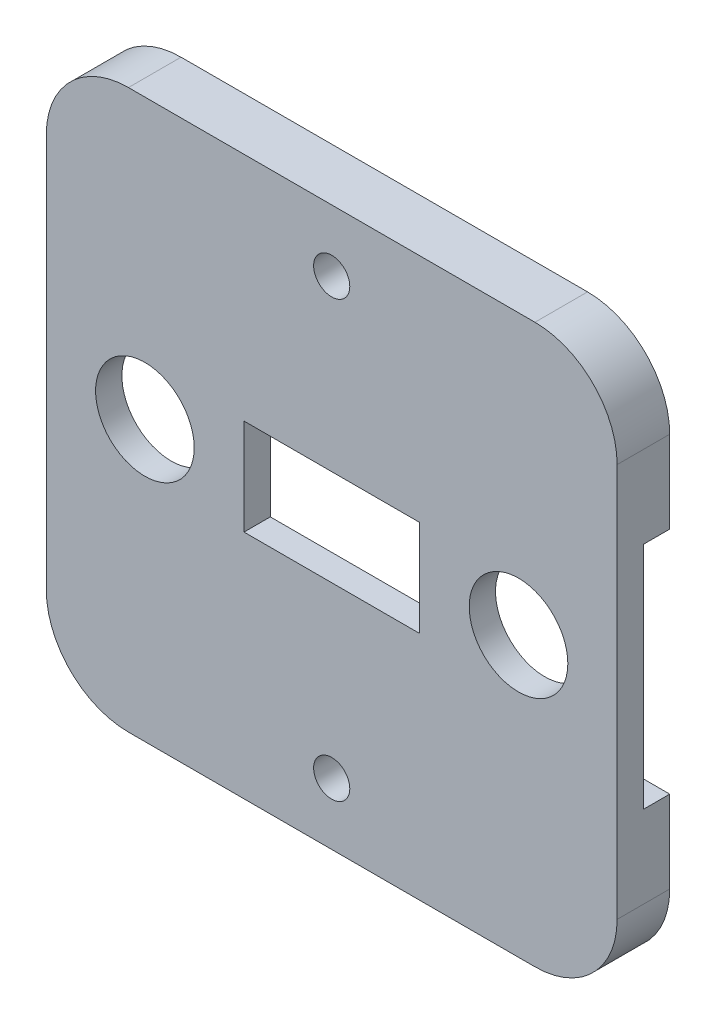
ISO-10303-21;
HEADER;
FILE_DESCRIPTION(('STEP AP214'),'2;1');
FILE_NAME('part.step','',(''),(''),'','','');
FILE_SCHEMA(('AUTOMOTIVE_DESIGN { 1 0 10303 214 1 1 1 1 }'));
ENDSEC;
DATA;
#1=APPLICATION_CONTEXT('core data for automotive mechanical design processes');
#2=APPLICATION_PROTOCOL_DEFINITION('international standard','automotive_design',2000,#1);
#3=PRODUCT_CONTEXT('',#1,'mechanical');
#4=PRODUCT('Part','Part','',(#3));
#5=PRODUCT_RELATED_PRODUCT_CATEGORY('part','',(#4));
#6=PRODUCT_DEFINITION_FORMATION('','',#4);
#7=PRODUCT_DEFINITION_CONTEXT('part definition',#1,'design');
#8=PRODUCT_DEFINITION('design','',#6,#7);
#9=PRODUCT_DEFINITION_SHAPE('','',#8);
#10=(LENGTH_UNIT() NAMED_UNIT(*) SI_UNIT(.MILLI.,.METRE.));
#11=(NAMED_UNIT(*) PLANE_ANGLE_UNIT() SI_UNIT($,.RADIAN.));
#12=(NAMED_UNIT(*) SI_UNIT($,.STERADIAN.) SOLID_ANGLE_UNIT());
#13=UNCERTAINTY_MEASURE_WITH_UNIT(LENGTH_MEASURE(1.E-05),#10,'distance_accuracy_value','');
#14=(GEOMETRIC_REPRESENTATION_CONTEXT(3) GLOBAL_UNCERTAINTY_ASSIGNED_CONTEXT((#13)) GLOBAL_UNIT_ASSIGNED_CONTEXT((#10,
#11,#12)) REPRESENTATION_CONTEXT('',''));
#15=CARTESIAN_POINT('',(0.,0.,0.));
#16=DIRECTION('',(0.,0.,1.));
#17=DIRECTION('',(1.,0.,0.));
#18=AXIS2_PLACEMENT_3D('',#15,#16,#17);
#19=CARTESIAN_POINT('',(22.0535500000001,-18.6229,52.5030879039006));
#20=DIRECTION('',(0.,-1.,0.));
#21=DIRECTION('',(1.,0.,0.));
#22=AXIS2_PLACEMENT_3D('',#19,#20,#21);
#23=PLANE('',#22);
#24=DIRECTION('',(0.,0.,-1.));
#25=VECTOR('',#24,1.);
#26=CARTESIAN_POINT('',(22.0535500000001,-18.6229,52.5030879039006));
#27=LINE('',#26,#25);
#28=CARTESIAN_POINT('',(22.0535500000001,-18.6229,2.03199999999999));
#29=VERTEX_POINT('',#28);
#30=CARTESIAN_POINT('',(22.0535500000001,-18.6229,0.));
#31=VERTEX_POINT('',#30);
#32=EDGE_CURVE('E263',#29,#31,#27,.T.);
#33=ORIENTED_EDGE('',*,*,#32,.F.);
#34=DIRECTION('',(-1.,0.,0.));
#35=VECTOR('',#34,1.);
#36=CARTESIAN_POINT('',(22.0535500000001,-18.6229,2.03199999999999));
#37=LINE('',#36,#35);
#38=CARTESIAN_POINT('',(-22.0535499999999,-18.6229,2.032));
#39=VERTEX_POINT('',#38);
#40=EDGE_CURVE('E204',#29,#39,#37,.T.);
#41=ORIENTED_EDGE('',*,*,#40,.T.);
#42=DIRECTION('',(0.,0.,-1.));
#43=VECTOR('',#42,1.);
#44=CARTESIAN_POINT('',(-22.0535499999999,-18.6229,52.5030879039006));
#45=LINE('',#44,#43);
#46=CARTESIAN_POINT('',(-22.0535499999999,-18.6229,0.));
#47=VERTEX_POINT('',#46);
#48=EDGE_CURVE('E155',#39,#47,#45,.T.);
#49=ORIENTED_EDGE('',*,*,#48,.T.);
#50=DIRECTION('',(-1.,0.,0.));
#51=VECTOR('',#50,1.);
#52=CARTESIAN_POINT('',(22.0535500000001,-18.6229,0.));
#53=LINE('',#52,#51);
#54=EDGE_CURVE('E246',#31,#47,#53,.T.);
#55=ORIENTED_EDGE('',*,*,#54,.F.);
#56=EDGE_LOOP('',(#33,#41,#49,#55));
#57=FACE_BOUND('',#56,.T.);
#58=ADVANCED_FACE('F33',(#57),#23,.T.);
#59=CARTESIAN_POINT('',(0.,0.,4.06399999999998));
#60=DIRECTION('',(0.,0.,1.));
#61=DIRECTION('',(1.,0.,0.));
#62=AXIS2_PLACEMENT_3D('',#59,#60,#61);
#63=PLANE('',#62);
#64=CARTESIAN_POINT('',(0.,-10.6854,4.06399999999999));
#65=DIRECTION('',(0.,0.,1.));
#66=DIRECTION('',(1.,0.,0.));
#67=AXIS2_PLACEMENT_3D('',#64,#65,#66);
#68=CIRCLE('',#67,1.39699999999999);
#69=CARTESIAN_POINT('',(1.39699999999999,-10.6854,4.06399999999999));
#70=VERTEX_POINT('',#69);
#71=EDGE_CURVE('E324',#70,#70,#68,.T.);
#72=ORIENTED_EDGE('',*,*,#71,.F.);
#73=EDGE_LOOP('',(#72));
#74=FACE_BOUND('',#73,.T.);
#75=CARTESIAN_POINT('',(0.,-44.2896,4.06399999999999));
#76=DIRECTION('',(0.,0.,1.));
#77=DIRECTION('',(1.,0.,0.));
#78=AXIS2_PLACEMENT_3D('',#75,#76,#77);
#79=CIRCLE('',#78,1.39699999999999);
#80=CARTESIAN_POINT('',(1.39699999999999,-44.2896,4.06399999999999));
#81=VERTEX_POINT('',#80);
#82=EDGE_CURVE('E318',#81,#81,#79,.T.);
#83=ORIENTED_EDGE('',*,*,#82,.F.);
#84=EDGE_LOOP('',(#83));
#85=FACE_BOUND('',#84,.T.);
#86=CARTESIAN_POINT('',(-15.7035499999999,-12.2729,4.06399999999998));
#87=DIRECTION('',(0.,0.,1.));
#88=DIRECTION('',(1.,0.,0.));
#89=AXIS2_PLACEMENT_3D('',#86,#87,#88);
#90=CIRCLE('',#89,6.35);
#91=CARTESIAN_POINT('',(-22.0535499999999,-12.2729,4.06399999999998));
#92=VERTEX_POINT('',#91);
#93=CARTESIAN_POINT('',(-15.7035499999999,-5.92289999999998,4.06399999999998));
#94=VERTEX_POINT('',#93);
#95=EDGE_CURVE('E151',#92,#94,#90,.F.);
#96=ORIENTED_EDGE('',*,*,#95,.F.);
#97=DIRECTION('',(0.,1.,0.));
#98=VECTOR('',#97,1.);
#99=CARTESIAN_POINT('',(-22.0535499999999,-18.6229,4.06399999999998));
#100=LINE('',#99,#98);
#101=CARTESIAN_POINT('',(-22.0535499999999,-42.7020999999999,4.06399999999998));
#102=VERTEX_POINT('',#101);
#103=EDGE_CURVE('E144',#102,#92,#100,.T.);
#104=ORIENTED_EDGE('',*,*,#103,.F.);
#105=CARTESIAN_POINT('',(-15.7035499999999,-42.7020999999999,4.06399999999998));
#106=DIRECTION('',(0.,0.,1.));
#107=DIRECTION('',(1.,0.,0.));
#108=AXIS2_PLACEMENT_3D('',#105,#106,#107);
#109=CIRCLE('',#108,6.35);
#110=CARTESIAN_POINT('',(-15.7035499999999,-49.0520999999999,4.064));
#111=VERTEX_POINT('',#110);
#112=EDGE_CURVE('E149',#111,#102,#109,.F.);
#113=ORIENTED_EDGE('',*,*,#112,.F.);
#114=DIRECTION('',(1.,0.,0.));
#115=VECTOR('',#114,1.);
#116=CARTESIAN_POINT('',(-15.7035499999999,-49.0520999999999,4.06399999999998));
#117=LINE('',#116,#115);
#118=CARTESIAN_POINT('',(15.7035500000001,-49.0520999999999,4.064));
#119=VERTEX_POINT('',#118);
#120=EDGE_CURVE('E177',#111,#119,#117,.T.);
#121=ORIENTED_EDGE('',*,*,#120,.T.);
#122=CARTESIAN_POINT('',(15.7035500000001,-42.7020999999999,4.06399999999998));
#123=DIRECTION('',(0.,0.,1.));
#124=DIRECTION('',(1.,0.,0.));
#125=AXIS2_PLACEMENT_3D('',#122,#123,#124);
#126=CIRCLE('',#125,6.35);
#127=CARTESIAN_POINT('',(22.0535500000001,-42.7020999999999,4.064));
#128=VERTEX_POINT('',#127);
#129=EDGE_CURVE('E180',#119,#128,#126,.T.);
#130=ORIENTED_EDGE('',*,*,#129,.T.);
#131=DIRECTION('',(0.,1.,0.));
#132=VECTOR('',#131,1.);
#133=CARTESIAN_POINT('',(22.0535500000001,-18.6229,4.06399999999998));
#134=LINE('',#133,#132);
#135=CARTESIAN_POINT('',(22.0535500000001,-12.2729,4.06399999999998));
#136=VERTEX_POINT('',#135);
#137=EDGE_CURVE('E245',#128,#136,#134,.T.);
#138=ORIENTED_EDGE('',*,*,#137,.T.);
#139=CARTESIAN_POINT('',(15.7035500000001,-12.2729,4.06399999999998));
#140=DIRECTION('',(0.,0.,1.));
#141=DIRECTION('',(1.,0.,0.));
#142=AXIS2_PLACEMENT_3D('',#139,#140,#141);
#143=CIRCLE('',#142,6.35);
#144=CARTESIAN_POINT('',(15.7035500000001,-5.92289999999999,4.06399999999998));
#145=VERTEX_POINT('',#144);
#146=EDGE_CURVE('E265',#145,#136,#143,.F.);
#147=ORIENTED_EDGE('',*,*,#146,.F.);
#148=DIRECTION('',(1.,0.,0.));
#149=VECTOR('',#148,1.);
#150=CARTESIAN_POINT('',(-15.7035499999999,-5.92289999999999,4.06399999999998));
#151=LINE('',#150,#149);
#152=EDGE_CURVE('E270',#94,#145,#151,.T.);
#153=ORIENTED_EDGE('',*,*,#152,.F.);
#154=EDGE_LOOP('',(#96,#104,#113,#121,#130,#138,#147,#153));
#155=FACE_BOUND('',#154,.T.);
#156=CARTESIAN_POINT('',(-14.4335499999999,-27.4875,4.06399999999998));
#157=DIRECTION('',(0.,0.,1.));
#158=DIRECTION('',(1.,0.,0.));
#159=AXIS2_PLACEMENT_3D('',#156,#157,#158);
#160=CIRCLE('',#159,3.81);
#161=CARTESIAN_POINT('',(-10.6235499999999,-27.4875,4.06399999999998));
#162=VERTEX_POINT('',#161);
#163=EDGE_CURVE('E169',#162,#162,#160,.T.);
#164=ORIENTED_EDGE('',*,*,#163,.F.);
#165=EDGE_LOOP('',(#164));
#166=FACE_BOUND('',#165,.T.);
#167=CARTESIAN_POINT('',(14.4335500000001,-27.4875,4.06399999999998));
#168=DIRECTION('',(0.,0.,1.));
#169=DIRECTION('',(1.,0.,0.));
#170=AXIS2_PLACEMENT_3D('',#167,#168,#169);
#171=CIRCLE('',#170,3.81);
#172=CARTESIAN_POINT('',(18.2435500000001,-27.4875,4.06399999999998));
#173=VERTEX_POINT('',#172);
#174=EDGE_CURVE('E172',#173,#173,#171,.T.);
#175=ORIENTED_EDGE('',*,*,#174,.F.);
#176=EDGE_LOOP('',(#175));
#177=FACE_BOUND('',#176,.T.);
#178=DIRECTION('',(-1.,0.,0.));
#179=VECTOR('',#178,1.);
#180=CARTESIAN_POINT('',(6.7754500000001,-23.77275,4.06399999999998));
#181=LINE('',#180,#179);
#182=CARTESIAN_POINT('',(6.7754500000001,-23.77275,4.06399999999998));
#183=VERTEX_POINT('',#182);
#184=CARTESIAN_POINT('',(-6.7754499999999,-23.77275,4.06399999999998));
#185=VERTEX_POINT('',#184);
#186=EDGE_CURVE('E223',#183,#185,#181,.T.);
#187=ORIENTED_EDGE('',*,*,#186,.F.);
#188=DIRECTION('',(0.,1.,0.));
#189=VECTOR('',#188,1.);
#190=CARTESIAN_POINT('',(6.7754500000001,-31.20225,4.06399999999998));
#191=LINE('',#190,#189);
#192=CARTESIAN_POINT('',(6.7754500000001,-31.20225,4.06399999999998));
#193=VERTEX_POINT('',#192);
#194=EDGE_CURVE('E232',#193,#183,#191,.T.);
#195=ORIENTED_EDGE('',*,*,#194,.F.);
#196=DIRECTION('',(1.,0.,0.));
#197=VECTOR('',#196,1.);
#198=CARTESIAN_POINT('',(-6.7754499999999,-31.20225,4.06399999999998));
#199=LINE('',#198,#197);
#200=CARTESIAN_POINT('',(-6.7754499999999,-31.20225,4.06399999999998));
#201=VERTEX_POINT('',#200);
#202=EDGE_CURVE('E229',#201,#193,#199,.T.);
#203=ORIENTED_EDGE('',*,*,#202,.F.);
#204=DIRECTION('',(0.,-1.,0.));
#205=VECTOR('',#204,1.);
#206=CARTESIAN_POINT('',(-6.7754499999999,-30.26245,4.06399999999998));
#207=LINE('',#206,#205);
#208=EDGE_CURVE('E226',#185,#201,#207,.T.);
#209=ORIENTED_EDGE('',*,*,#208,.F.);
#210=EDGE_LOOP('',(#187,#195,#203,#209));
#211=FACE_BOUND('',#210,.T.);
#212=ADVANCED_FACE('F35',(#74,#85,#155,#166,#177,#211),#63,.T.);
#213=CARTESIAN_POINT('',(15.7035500000001,-12.2729,0.));
#214=DIRECTION('',(0.,0.,-1.));
#215=DIRECTION('',(-1.,0.,0.));
#216=AXIS2_PLACEMENT_3D('',#213,#214,#215);
#217=PLANE('',#216);
#218=CARTESIAN_POINT('',(0.,-10.6854,0.));
#219=DIRECTION('',(0.,0.,1.));
#220=DIRECTION('',(1.,0.,0.));
#221=AXIS2_PLACEMENT_3D('',#218,#219,#220);
#222=CIRCLE('',#221,1.397);
#223=CARTESIAN_POINT('',(1.397,-10.6854,0.));
#224=VERTEX_POINT('',#223);
#225=EDGE_CURVE('E321',#224,#224,#222,.T.);
#226=ORIENTED_EDGE('',*,*,#225,.T.);
#227=EDGE_LOOP('',(#226));
#228=FACE_BOUND('',#227,.T.);
#229=DIRECTION('',(0.,1.,0.));
#230=VECTOR('',#229,1.);
#231=CARTESIAN_POINT('',(22.0535500000001,-18.6229,0.));
#232=LINE('',#231,#230);
#233=CARTESIAN_POINT('',(22.0535500000001,-12.2729,0.));
#234=VERTEX_POINT('',#233);
#235=EDGE_CURVE('E41',#31,#234,#232,.T.);
#236=ORIENTED_EDGE('',*,*,#235,.F.);
#237=ORIENTED_EDGE('',*,*,#54,.T.);
#238=DIRECTION('',(0.,1.,0.));
#239=VECTOR('',#238,1.);
#240=CARTESIAN_POINT('',(-22.0535499999999,-18.6229,0.));
#241=LINE('',#240,#239);
#242=CARTESIAN_POINT('',(-22.0535499999999,-12.2729,0.));
#243=VERTEX_POINT('',#242);
#244=EDGE_CURVE('E249',#47,#243,#241,.T.);
#245=ORIENTED_EDGE('',*,*,#244,.T.);
#246=CARTESIAN_POINT('',(-15.7035499999999,-12.2729,0.));
#247=DIRECTION('',(0.,0.,-1.));
#248=DIRECTION('',(-1.,0.,0.));
#249=AXIS2_PLACEMENT_3D('',#246,#247,#248);
#250=CIRCLE('',#249,6.35);
#251=CARTESIAN_POINT('',(-15.7035499999999,-5.92289999999998,0.));
#252=VERTEX_POINT('',#251);
#253=EDGE_CURVE('E252',#243,#252,#250,.T.);
#254=ORIENTED_EDGE('',*,*,#253,.T.);
#255=DIRECTION('',(1.,0.,0.));
#256=VECTOR('',#255,1.);
#257=CARTESIAN_POINT('',(-15.7035499999999,-5.92289999999999,0.));
#258=LINE('',#257,#256);
#259=CARTESIAN_POINT('',(15.7035500000001,-5.92289999999999,0.));
#260=VERTEX_POINT('',#259);
#261=EDGE_CURVE('E255',#252,#260,#258,.T.);
#262=ORIENTED_EDGE('',*,*,#261,.T.);
#263=CARTESIAN_POINT('',(15.7035500000001,-12.2729,0.));
#264=DIRECTION('',(0.,0.,-1.));
#265=DIRECTION('',(-1.,0.,0.));
#266=AXIS2_PLACEMENT_3D('',#263,#264,#265);
#267=CIRCLE('',#266,6.35);
#268=EDGE_CURVE('E258',#260,#234,#267,.T.);
#269=ORIENTED_EDGE('',*,*,#268,.T.);
#270=EDGE_LOOP('',(#236,#237,#245,#254,#262,#269));
#271=FACE_BOUND('',#270,.T.);
#272=ADVANCED_FACE('F288',(#228,#271),#217,.T.);
#273=CARTESIAN_POINT('',(-22.0535499999999,-18.6229,52.5030879039006));
#274=DIRECTION('',(-1.,0.,0.));
#275=DIRECTION('',(0.,0.,1.));
#276=AXIS2_PLACEMENT_3D('',#273,#274,#275);
#277=PLANE('',#276);
#278=DIRECTION('',(0.,1.,0.));
#279=VECTOR('',#278,1.);
#280=CARTESIAN_POINT('',(-22.0535499999999,-15.4479,2.03199999999999));
#281=LINE('',#280,#279);
#282=CARTESIAN_POINT('',(-22.0535499999999,-36.3520999999999,2.032));
#283=VERTEX_POINT('',#282);
#284=EDGE_CURVE('E52',#283,#39,#281,.T.);
#285=ORIENTED_EDGE('',*,*,#284,.F.);
#286=DIRECTION('',(0.,0.,-1.));
#287=VECTOR('',#286,1.);
#288=CARTESIAN_POINT('',(-22.0535499999999,-36.3520999999999,52.5030879039006));
#289=LINE('',#288,#287);
#290=CARTESIAN_POINT('',(-22.0535499999999,-36.3520999999999,0.));
#291=VERTEX_POINT('',#290);
#292=EDGE_CURVE('E188',#283,#291,#289,.T.);
#293=ORIENTED_EDGE('',*,*,#292,.T.);
#294=DIRECTION('',(0.,-1.,0.));
#295=VECTOR('',#294,1.);
#296=CARTESIAN_POINT('',(-22.0535499999999,-36.3520999999999,0.));
#297=LINE('',#296,#295);
#298=CARTESIAN_POINT('',(-22.0535499999999,-42.7020999999999,0.));
#299=VERTEX_POINT('',#298);
#300=EDGE_CURVE('E161',#291,#299,#297,.T.);
#301=ORIENTED_EDGE('',*,*,#300,.T.);
#302=DIRECTION('',(0.,0.,-1.));
#303=VECTOR('',#302,1.);
#304=CARTESIAN_POINT('',(-22.0535499999999,-42.7020999999999,52.5030879039006));
#305=LINE('',#304,#303);
#306=EDGE_CURVE('E158',#102,#299,#305,.T.);
#307=ORIENTED_EDGE('',*,*,#306,.F.);
#308=ORIENTED_EDGE('',*,*,#103,.T.);
#309=DIRECTION('',(0.,0.,-1.));
#310=VECTOR('',#309,1.);
#311=CARTESIAN_POINT('',(-22.0535499999999,-12.2729,52.5030879039006));
#312=LINE('',#311,#310);
#313=EDGE_CURVE('E154',#92,#243,#312,.T.);
#314=ORIENTED_EDGE('',*,*,#313,.T.);
#315=ORIENTED_EDGE('',*,*,#244,.F.);
#316=ORIENTED_EDGE('',*,*,#48,.F.);
#317=EDGE_LOOP('',(#285,#293,#301,#307,#308,#314,#315,#316));
#318=FACE_BOUND('',#317,.T.);
#319=ADVANCED_FACE('F159',(#318),#277,.T.);
#320=CARTESIAN_POINT('',(-15.7035499999999,-12.2729,52.5030879039006));
#321=DIRECTION('',(0.,0.,-1.));
#322=DIRECTION('',(-1.,0.,0.));
#323=AXIS2_PLACEMENT_3D('',#320,#321,#322);
#324=CYLINDRICAL_SURFACE('',#323,6.35);
#325=ORIENTED_EDGE('',*,*,#313,.F.);
#326=ORIENTED_EDGE('',*,*,#95,.T.);
#327=DIRECTION('',(0.,0.,-1.));
#328=VECTOR('',#327,1.);
#329=CARTESIAN_POINT('',(-15.7035499999999,-5.92289999999998,52.5030879039006));
#330=LINE('',#329,#328);
#331=EDGE_CURVE('E273',#94,#252,#330,.T.);
#332=ORIENTED_EDGE('',*,*,#331,.T.);
#333=ORIENTED_EDGE('',*,*,#253,.F.);
#334=EDGE_LOOP('',(#325,#326,#332,#333));
#335=FACE_BOUND('',#334,.T.);
#336=ADVANCED_FACE('F295',(#335),#324,.T.);
#337=CARTESIAN_POINT('',(-15.7035499999999,-5.92289999999999,52.5030879039006));
#338=DIRECTION('',(0.,1.,0.));
#339=DIRECTION('',(0.,0.,1.));
#340=AXIS2_PLACEMENT_3D('',#337,#338,#339);
#341=PLANE('',#340);
#342=ORIENTED_EDGE('',*,*,#331,.F.);
#343=ORIENTED_EDGE('',*,*,#152,.T.);
#344=DIRECTION('',(0.,0.,-1.));
#345=VECTOR('',#344,1.);
#346=CARTESIAN_POINT('',(15.7035500000001,-5.92289999999999,52.5030879039006));
#347=LINE('',#346,#345);
#348=EDGE_CURVE('E269',#145,#260,#347,.T.);
#349=ORIENTED_EDGE('',*,*,#348,.T.);
#350=ORIENTED_EDGE('',*,*,#261,.F.);
#351=EDGE_LOOP('',(#342,#343,#349,#350));
#352=FACE_BOUND('',#351,.T.);
#353=ADVANCED_FACE('F298',(#352),#341,.T.);
#354=CARTESIAN_POINT('',(15.7035500000001,-12.2729,52.5030879039006));
#355=DIRECTION('',(0.,0.,-1.));
#356=DIRECTION('',(-1.,0.,0.));
#357=AXIS2_PLACEMENT_3D('',#354,#355,#356);
#358=CYLINDRICAL_SURFACE('',#357,6.35);
#359=ORIENTED_EDGE('',*,*,#348,.F.);
#360=ORIENTED_EDGE('',*,*,#146,.T.);
#361=DIRECTION('',(0.,0.,-1.));
#362=VECTOR('',#361,1.);
#363=CARTESIAN_POINT('',(22.0535500000001,-12.2729,52.5030879039006));
#364=LINE('',#363,#362);
#365=EDGE_CURVE('E268',#136,#234,#364,.T.);
#366=ORIENTED_EDGE('',*,*,#365,.T.);
#367=ORIENTED_EDGE('',*,*,#268,.F.);
#368=EDGE_LOOP('',(#359,#360,#366,#367));
#369=FACE_BOUND('',#368,.T.);
#370=ADVANCED_FACE('F301',(#369),#358,.T.);
#371=CARTESIAN_POINT('',(22.0535500000001,-18.6229,52.5030879039006));
#372=DIRECTION('',(-1.,0.,0.));
#373=DIRECTION('',(0.,0.,1.));
#374=AXIS2_PLACEMENT_3D('',#371,#372,#373);
#375=PLANE('',#374);
#376=ORIENTED_EDGE('',*,*,#365,.F.);
#377=ORIENTED_EDGE('',*,*,#137,.F.);
#378=DIRECTION('',(0.,0.,-1.));
#379=VECTOR('',#378,1.);
#380=CARTESIAN_POINT('',(22.0535500000001,-42.7020999999999,52.5030879039006));
#381=LINE('',#380,#379);
#382=CARTESIAN_POINT('',(22.0535500000001,-42.7020999999999,0.));
#383=VERTEX_POINT('',#382);
#384=EDGE_CURVE('E197',#128,#383,#381,.T.);
#385=ORIENTED_EDGE('',*,*,#384,.T.);
#386=DIRECTION('',(0.,-1.,0.));
#387=VECTOR('',#386,1.);
#388=CARTESIAN_POINT('',(22.0535500000001,-36.3520999999999,0.));
#389=LINE('',#388,#387);
#390=CARTESIAN_POINT('',(22.0535500000001,-36.3520999999999,0.));
#391=VERTEX_POINT('',#390);
#392=EDGE_CURVE('E179',#391,#383,#389,.T.);
#393=ORIENTED_EDGE('',*,*,#392,.F.);
#394=DIRECTION('',(0.,0.,-1.));
#395=VECTOR('',#394,1.);
#396=CARTESIAN_POINT('',(22.0535500000001,-36.3520999999999,52.5030879039006));
#397=LINE('',#396,#395);
#398=CARTESIAN_POINT('',(22.0535500000001,-36.3520999999999,2.03199999999999));
#399=VERTEX_POINT('',#398);
#400=EDGE_CURVE('E308',#399,#391,#397,.T.);
#401=ORIENTED_EDGE('',*,*,#400,.F.);
#402=DIRECTION('',(0.,-1.,0.));
#403=VECTOR('',#402,1.);
#404=CARTESIAN_POINT('',(22.0535500000001,-39.5270999999999,2.03199999999999));
#405=LINE('',#404,#403);
#406=EDGE_CURVE('E47',#29,#399,#405,.T.);
#407=ORIENTED_EDGE('',*,*,#406,.F.);
#408=ORIENTED_EDGE('',*,*,#32,.T.);
#409=ORIENTED_EDGE('',*,*,#235,.T.);
#410=EDGE_LOOP('',(#376,#377,#385,#393,#401,#407,#408,#409));
#411=FACE_BOUND('',#410,.T.);
#412=ADVANCED_FACE('F283',(#411),#375,.F.);
#413=CARTESIAN_POINT('',(-6.7754499999999,-30.26245,-48.7278073610293));
#414=DIRECTION('',(-1.,0.,0.));
#415=DIRECTION('',(0.,0.,1.));
#416=AXIS2_PLACEMENT_3D('',#413,#414,#415);
#417=PLANE('',#416);
#418=DIRECTION('',(0.,0.,1.));
#419=VECTOR('',#418,1.);
#420=CARTESIAN_POINT('',(-6.7754499999999,-31.20225,-48.7278073610293));
#421=LINE('',#420,#419);
#422=CARTESIAN_POINT('',(-6.7754499999999,-31.20225,2.03199999999999));
#423=VERTEX_POINT('',#422);
#424=EDGE_CURVE('E239',#423,#201,#421,.T.);
#425=ORIENTED_EDGE('',*,*,#424,.F.);
#426=DIRECTION('',(0.,1.,0.));
#427=VECTOR('',#426,1.);
#428=CARTESIAN_POINT('',(-6.7754499999999,-30.26245,2.03199999999999));
#429=LINE('',#428,#427);
#430=CARTESIAN_POINT('',(-6.7754499999999,-23.77275,2.03199999999997));
#431=VERTEX_POINT('',#430);
#432=EDGE_CURVE('E206',#423,#431,#429,.T.);
#433=ORIENTED_EDGE('',*,*,#432,.T.);
#434=DIRECTION('',(0.,0.,1.));
#435=VECTOR('',#434,1.);
#436=CARTESIAN_POINT('',(-6.7754499999999,-23.77275,-48.7278073610293));
#437=LINE('',#436,#435);
#438=EDGE_CURVE('E235',#431,#185,#437,.T.);
#439=ORIENTED_EDGE('',*,*,#438,.T.);
#440=ORIENTED_EDGE('',*,*,#208,.T.);
#441=EDGE_LOOP('',(#425,#433,#439,#440));
#442=FACE_BOUND('',#441,.T.);
#443=ADVANCED_FACE('F363',(#442),#417,.F.);
#444=CARTESIAN_POINT('',(-6.7754499999999,-31.20225,-48.7278073610293));
#445=DIRECTION('',(0.,-1.,0.));
#446=DIRECTION('',(0.,0.,-1.));
#447=AXIS2_PLACEMENT_3D('',#444,#445,#446);
#448=PLANE('',#447);
#449=DIRECTION('',(0.,0.,1.));
#450=VECTOR('',#449,1.);
#451=CARTESIAN_POINT('',(6.7754500000001,-31.20225,-48.7278073610293));
#452=LINE('',#451,#450);
#453=CARTESIAN_POINT('',(6.7754500000001,-31.20225,2.03199999999999));
#454=VERTEX_POINT('',#453);
#455=EDGE_CURVE('E237',#454,#193,#452,.T.);
#456=ORIENTED_EDGE('',*,*,#455,.F.);
#457=DIRECTION('',(-1.,0.,0.));
#458=VECTOR('',#457,1.);
#459=CARTESIAN_POINT('',(-6.7754499999999,-31.20225,2.03199999999999));
#460=LINE('',#459,#458);
#461=EDGE_CURVE('E210',#454,#423,#460,.T.);
#462=ORIENTED_EDGE('',*,*,#461,.T.);
#463=ORIENTED_EDGE('',*,*,#424,.T.);
#464=ORIENTED_EDGE('',*,*,#202,.T.);
#465=EDGE_LOOP('',(#456,#462,#463,#464));
#466=FACE_BOUND('',#465,.T.);
#467=ADVANCED_FACE('F375',(#466),#448,.F.);
#468=CARTESIAN_POINT('',(6.7754500000001,-31.20225,-48.7278073610293));
#469=DIRECTION('',(1.,0.,0.));
#470=DIRECTION('',(0.,0.,-1.));
#471=AXIS2_PLACEMENT_3D('',#468,#469,#470);
#472=PLANE('',#471);
#473=DIRECTION('',(0.,0.,1.));
#474=VECTOR('',#473,1.);
#475=CARTESIAN_POINT('',(6.7754500000001,-23.77275,-48.7278073610293));
#476=LINE('',#475,#474);
#477=CARTESIAN_POINT('',(6.7754500000001,-23.77275,2.03199999999999));
#478=VERTEX_POINT('',#477);
#479=EDGE_CURVE('E209',#478,#183,#476,.T.);
#480=ORIENTED_EDGE('',*,*,#479,.F.);
#481=DIRECTION('',(0.,-1.,0.));
#482=VECTOR('',#481,1.);
#483=CARTESIAN_POINT('',(6.7754500000001,-31.20225,2.03199999999999));
#484=LINE('',#483,#482);
#485=EDGE_CURVE('E213',#478,#454,#484,.T.);
#486=ORIENTED_EDGE('',*,*,#485,.T.);
#487=ORIENTED_EDGE('',*,*,#455,.T.);
#488=ORIENTED_EDGE('',*,*,#194,.T.);
#489=EDGE_LOOP('',(#480,#486,#487,#488));
#490=FACE_BOUND('',#489,.T.);
#491=ADVANCED_FACE('F371',(#490),#472,.F.);
#492=CARTESIAN_POINT('',(6.7754500000001,-23.77275,-48.7278073610293));
#493=DIRECTION('',(0.,1.,0.));
#494=DIRECTION('',(-1.,0.,0.));
#495=AXIS2_PLACEMENT_3D('',#492,#493,#494);
#496=PLANE('',#495);
#497=ORIENTED_EDGE('',*,*,#438,.F.);
#498=DIRECTION('',(1.,0.,0.));
#499=VECTOR('',#498,1.);
#500=CARTESIAN_POINT('',(6.7754500000001,-23.77275,2.03199999999999));
#501=LINE('',#500,#499);
#502=EDGE_CURVE('E216',#431,#478,#501,.T.);
#503=ORIENTED_EDGE('',*,*,#502,.T.);
#504=ORIENTED_EDGE('',*,*,#479,.T.);
#505=ORIENTED_EDGE('',*,*,#186,.T.);
#506=EDGE_LOOP('',(#497,#503,#504,#505));
#507=FACE_BOUND('',#506,.T.);
#508=ADVANCED_FACE('F367',(#507),#496,.F.);
#509=CARTESIAN_POINT('',(14.4335500000001,-27.4875,-48.7278073610293));
#510=DIRECTION('',(0.,0.,1.));
#511=DIRECTION('',(1.,0.,0.));
#512=AXIS2_PLACEMENT_3D('',#509,#510,#511);
#513=CYLINDRICAL_SURFACE('',#512,3.81);
#514=CARTESIAN_POINT('',(14.4335500000001,-27.4875,2.03199999999999));
#515=DIRECTION('',(0.,0.,1.));
#516=DIRECTION('',(1.,0.,0.));
#517=AXIS2_PLACEMENT_3D('',#514,#515,#516);
#518=CIRCLE('',#517,3.81);
#519=CARTESIAN_POINT('',(18.2435500000001,-27.4875,2.03199999999998));
#520=VERTEX_POINT('',#519);
#521=EDGE_CURVE('E201',#520,#520,#518,.F.);
#522=CARTESIAN_POINT('',(18.2435500000001,-27.4875,2.03199999999998));
#523=CARTESIAN_POINT('',(18.2435500000001,-27.4875,2.05316666666665));
#524=CARTESIAN_POINT('',(18.2435500000001,-27.4875,2.07433333333331));
#525=CARTESIAN_POINT('',(18.2435500000001,-27.4875,2.11666666666665));
#526=CARTESIAN_POINT('',(18.2435500000001,-27.4875,2.13783333333331));
#527=CARTESIAN_POINT('',(18.2435500000001,-27.4875,2.18016666666665));
#528=CARTESIAN_POINT('',(18.2435500000001,-27.4875,2.20133333333331));
#529=CARTESIAN_POINT('',(18.2435500000001,-27.4875,2.24366666666665));
#530=CARTESIAN_POINT('',(18.2435500000001,-27.4875,2.26483333333332));
#531=CARTESIAN_POINT('',(18.2435500000001,-27.4875,2.30716666666665));
#532=CARTESIAN_POINT('',(18.2435500000001,-27.4875,2.32833333333331));
#533=CARTESIAN_POINT('',(18.2435500000001,-27.4875,2.37066666666664));
#534=CARTESIAN_POINT('',(18.2435500000001,-27.4875,2.39183333333331));
#535=CARTESIAN_POINT('',(18.2435500000001,-27.4875,2.43416666666664));
#536=CARTESIAN_POINT('',(18.2435500000001,-27.4875,2.45533333333331));
#537=CARTESIAN_POINT('',(18.2435500000001,-27.4875,2.49766666666665));
#538=CARTESIAN_POINT('',(18.2435500000001,-27.4875,2.51883333333331));
#539=CARTESIAN_POINT('',(18.2435500000001,-27.4875,2.56116666666665));
#540=CARTESIAN_POINT('',(18.2435500000001,-27.4875,2.58233333333331));
#541=CARTESIAN_POINT('',(18.2435500000001,-27.4875,2.62466666666665));
#542=CARTESIAN_POINT('',(18.2435500000001,-27.4875,2.64583333333331));
#543=CARTESIAN_POINT('',(18.2435500000001,-27.4875,2.68816666666665));
#544=CARTESIAN_POINT('',(18.2435500000001,-27.4875,2.70933333333332));
#545=CARTESIAN_POINT('',(18.2435500000001,-27.4875,2.75166666666665));
#546=CARTESIAN_POINT('',(18.2435500000001,-27.4875,2.77283333333331));
#547=CARTESIAN_POINT('',(18.2435500000001,-27.4875,2.81516666666664));
#548=CARTESIAN_POINT('',(18.2435500000001,-27.4875,2.83633333333331));
#549=CARTESIAN_POINT('',(18.2435500000001,-27.4875,2.87866666666665));
#550=CARTESIAN_POINT('',(18.2435500000001,-27.4875,2.89983333333331));
#551=CARTESIAN_POINT('',(18.2435500000001,-27.4875,2.94216666666665));
#552=CARTESIAN_POINT('',(18.2435500000001,-27.4875,2.96333333333331));
#553=CARTESIAN_POINT('',(18.2435500000001,-27.4875,3.00566666666665));
#554=CARTESIAN_POINT('',(18.2435500000001,-27.4875,3.02683333333331));
#555=CARTESIAN_POINT('',(18.2435500000001,-27.4875,3.06916666666665));
#556=CARTESIAN_POINT('',(18.2435500000001,-27.4875,3.09033333333332));
#557=CARTESIAN_POINT('',(18.2435500000001,-27.4875,3.13266666666665));
#558=CARTESIAN_POINT('',(18.2435500000001,-27.4875,3.15383333333332));
#559=CARTESIAN_POINT('',(18.2435500000001,-27.4875,3.19616666666665));
#560=CARTESIAN_POINT('',(18.2435500000001,-27.4875,3.21733333333332));
#561=CARTESIAN_POINT('',(18.2435500000001,-27.4875,3.25966666666665));
#562=CARTESIAN_POINT('',(18.2435500000001,-27.4875,3.28083333333332));
#563=CARTESIAN_POINT('',(18.2435500000001,-27.4875,3.32316666666665));
#564=CARTESIAN_POINT('',(18.2435500000001,-27.4875,3.34433333333331));
#565=CARTESIAN_POINT('',(18.2435500000001,-27.4875,3.38666666666665));
#566=CARTESIAN_POINT('',(18.2435500000001,-27.4875,3.40783333333331));
#567=CARTESIAN_POINT('',(18.2435500000001,-27.4875,3.45016666666665));
#568=CARTESIAN_POINT('',(18.2435500000001,-27.4875,3.47133333333331));
#569=CARTESIAN_POINT('',(18.2435500000001,-27.4875,3.51366666666665));
#570=CARTESIAN_POINT('',(18.2435500000001,-27.4875,3.53483333333332));
#571=CARTESIAN_POINT('',(18.2435500000001,-27.4875,3.57716666666665));
#572=CARTESIAN_POINT('',(18.2435500000001,-27.4875,3.59833333333332));
#573=CARTESIAN_POINT('',(18.2435500000001,-27.4875,3.64066666666665));
#574=CARTESIAN_POINT('',(18.2435500000001,-27.4875,3.66183333333332));
#575=CARTESIAN_POINT('',(18.2435500000001,-27.4875,3.70416666666665));
#576=CARTESIAN_POINT('',(18.2435500000001,-27.4875,3.72533333333332));
#577=CARTESIAN_POINT('',(18.2435500000001,-27.4875,3.76766666666665));
#578=CARTESIAN_POINT('',(18.2435500000001,-27.4875,3.78883333333332));
#579=CARTESIAN_POINT('',(18.2435500000001,-27.4875,3.83116666666665));
#580=CARTESIAN_POINT('',(18.2435500000001,-27.4875,3.85233333333331));
#581=CARTESIAN_POINT('',(18.2435500000001,-27.4875,3.89466666666665));
#582=CARTESIAN_POINT('',(18.2435500000001,-27.4875,3.91583333333332));
#583=CARTESIAN_POINT('',(18.2435500000001,-27.4875,3.95816666666665));
#584=CARTESIAN_POINT('',(18.2435500000001,-27.4875,3.97933333333332));
#585=CARTESIAN_POINT('',(18.2435500000001,-27.4875,4.02166666666665));
#586=CARTESIAN_POINT('',(18.2435500000001,-27.4875,4.04283333333332));
#587=CARTESIAN_POINT('',(18.2435500000001,-27.4875,4.06399999999998));
#588=B_SPLINE_CURVE_WITH_KNOTS('',3,(#522,#523,#524,#525,#526,#527,#528,#529,#530,#531,#532,
#533,#534,#535,#536,#537,#538,#539,#540,#541,#542,#543,#544,#545,#546,#547,#548,#549,#550,#551,
#552,#553,#554,#555,#556,#557,#558,#559,#560,#561,#562,#563,#564,#565,#566,#567,#568,#569,#570,
#571,#572,#573,#574,#575,#576,#577,#578,#579,#580,#581,#582,#583,#584,#585,#586,#587),
.UNSPECIFIED.,.F.,.F.,(4,2,2,2,2,2,2,2,2,2,2,2,2,2,2,2,2,2,2,2,2,2,2,2,2,2,2,2,2,2,2,2,4),(0.,
0.0635000000000011,0.127000000000002,0.190500000000003,0.254000000000004,0.317499999999998,
0.380999999999999,0.4445,0.508000000000002,0.571500000000003,0.635000000000004,
0.698500000000005,0.761999999999999,0.8255,0.889000000000001,0.952500000000002,1.016,1.0795,
1.14300000000001,1.20650000000001,1.27000000000001,1.3335,1.397,1.4605,1.524,1.58750000000001,
1.65100000000001,1.71450000000001,1.778,1.8415,1.905,1.96850000000001,2.03200000000001),.UNSPECIFIED.);
#589=EDGE_CURVE('BSEAM370',#520,#173,#588,.T.);
#590=ORIENTED_EDGE('',*,*,#521,.T.);
#591=ORIENTED_EDGE('',*,*,#174,.T.);
#592=ORIENTED_EDGE('',*,*,#589,.T.);
#593=ORIENTED_EDGE('',*,*,#589,.F.);
#594=EDGE_LOOP('',(#590,#592,#591,#593));
#595=FACE_BOUND('',#594,.T.);
#596=ADVANCED_FACE('F370',(#595),#513,.F.);
#597=CARTESIAN_POINT('',(-14.4335499999999,-27.4875,-48.7278073610293));
#598=DIRECTION('',(0.,0.,1.));
#599=DIRECTION('',(1.,0.,0.));
#600=AXIS2_PLACEMENT_3D('',#597,#598,#599);
#601=CYLINDRICAL_SURFACE('',#600,3.81);
#602=CARTESIAN_POINT('',(-14.4335499999999,-27.4875,2.03199999999999));
#603=DIRECTION('',(0.,0.,1.));
#604=DIRECTION('',(1.,0.,0.));
#605=AXIS2_PLACEMENT_3D('',#602,#603,#604);
#606=CIRCLE('',#605,3.81);
#607=CARTESIAN_POINT('',(-10.6235499999999,-27.4875,2.03199999999998));
#608=VERTEX_POINT('',#607);
#609=EDGE_CURVE('E205',#608,#608,#606,.F.);
#610=CARTESIAN_POINT('',(-10.6235499999999,-27.4875,2.03199999999998));
#611=CARTESIAN_POINT('',(-10.6235499999999,-27.4875,2.05316666666665));
#612=CARTESIAN_POINT('',(-10.6235499999999,-27.4875,2.07433333333331));
#613=CARTESIAN_POINT('',(-10.6235499999999,-27.4875,2.11666666666665));
#614=CARTESIAN_POINT('',(-10.6235499999999,-27.4875,2.13783333333331));
#615=CARTESIAN_POINT('',(-10.6235499999999,-27.4875,2.18016666666665));
#616=CARTESIAN_POINT('',(-10.6235499999999,-27.4875,2.20133333333331));
#617=CARTESIAN_POINT('',(-10.6235499999999,-27.4875,2.24366666666665));
#618=CARTESIAN_POINT('',(-10.6235499999999,-27.4875,2.26483333333332));
#619=CARTESIAN_POINT('',(-10.6235499999999,-27.4875,2.30716666666665));
#620=CARTESIAN_POINT('',(-10.6235499999999,-27.4875,2.32833333333331));
#621=CARTESIAN_POINT('',(-10.6235499999999,-27.4875,2.37066666666664));
#622=CARTESIAN_POINT('',(-10.6235499999999,-27.4875,2.39183333333331));
#623=CARTESIAN_POINT('',(-10.6235499999999,-27.4875,2.43416666666664));
#624=CARTESIAN_POINT('',(-10.6235499999999,-27.4875,2.45533333333331));
#625=CARTESIAN_POINT('',(-10.6235499999999,-27.4875,2.49766666666665));
#626=CARTESIAN_POINT('',(-10.6235499999999,-27.4875,2.51883333333331));
#627=CARTESIAN_POINT('',(-10.6235499999999,-27.4875,2.56116666666665));
#628=CARTESIAN_POINT('',(-10.6235499999999,-27.4875,2.58233333333331));
#629=CARTESIAN_POINT('',(-10.6235499999999,-27.4875,2.62466666666665));
#630=CARTESIAN_POINT('',(-10.6235499999999,-27.4875,2.64583333333331));
#631=CARTESIAN_POINT('',(-10.6235499999999,-27.4875,2.68816666666665));
#632=CARTESIAN_POINT('',(-10.6235499999999,-27.4875,2.70933333333332));
#633=CARTESIAN_POINT('',(-10.6235499999999,-27.4875,2.75166666666665));
#634=CARTESIAN_POINT('',(-10.6235499999999,-27.4875,2.77283333333331));
#635=CARTESIAN_POINT('',(-10.6235499999999,-27.4875,2.81516666666664));
#636=CARTESIAN_POINT('',(-10.6235499999999,-27.4875,2.83633333333331));
#637=CARTESIAN_POINT('',(-10.6235499999999,-27.4875,2.87866666666665));
#638=CARTESIAN_POINT('',(-10.6235499999999,-27.4875,2.89983333333331));
#639=CARTESIAN_POINT('',(-10.6235499999999,-27.4875,2.94216666666665));
#640=CARTESIAN_POINT('',(-10.6235499999999,-27.4875,2.96333333333331));
#641=CARTESIAN_POINT('',(-10.6235499999999,-27.4875,3.00566666666665));
#642=CARTESIAN_POINT('',(-10.6235499999999,-27.4875,3.02683333333331));
#643=CARTESIAN_POINT('',(-10.6235499999999,-27.4875,3.06916666666665));
#644=CARTESIAN_POINT('',(-10.6235499999999,-27.4875,3.09033333333332));
#645=CARTESIAN_POINT('',(-10.6235499999999,-27.4875,3.13266666666665));
#646=CARTESIAN_POINT('',(-10.6235499999999,-27.4875,3.15383333333332));
#647=CARTESIAN_POINT('',(-10.6235499999999,-27.4875,3.19616666666665));
#648=CARTESIAN_POINT('',(-10.6235499999999,-27.4875,3.21733333333332));
#649=CARTESIAN_POINT('',(-10.6235499999999,-27.4875,3.25966666666665));
#650=CARTESIAN_POINT('',(-10.6235499999999,-27.4875,3.28083333333332));
#651=CARTESIAN_POINT('',(-10.6235499999999,-27.4875,3.32316666666665));
#652=CARTESIAN_POINT('',(-10.6235499999999,-27.4875,3.34433333333331));
#653=CARTESIAN_POINT('',(-10.6235499999999,-27.4875,3.38666666666665));
#654=CARTESIAN_POINT('',(-10.6235499999999,-27.4875,3.40783333333331));
#655=CARTESIAN_POINT('',(-10.6235499999999,-27.4875,3.45016666666665));
#656=CARTESIAN_POINT('',(-10.6235499999999,-27.4875,3.47133333333331));
#657=CARTESIAN_POINT('',(-10.6235499999999,-27.4875,3.51366666666665));
#658=CARTESIAN_POINT('',(-10.6235499999999,-27.4875,3.53483333333332));
#659=CARTESIAN_POINT('',(-10.6235499999999,-27.4875,3.57716666666665));
#660=CARTESIAN_POINT('',(-10.6235499999999,-27.4875,3.59833333333332));
#661=CARTESIAN_POINT('',(-10.6235499999999,-27.4875,3.64066666666665));
#662=CARTESIAN_POINT('',(-10.6235499999999,-27.4875,3.66183333333332));
#663=CARTESIAN_POINT('',(-10.6235499999999,-27.4875,3.70416666666665));
#664=CARTESIAN_POINT('',(-10.6235499999999,-27.4875,3.72533333333332));
#665=CARTESIAN_POINT('',(-10.6235499999999,-27.4875,3.76766666666665));
#666=CARTESIAN_POINT('',(-10.6235499999999,-27.4875,3.78883333333332));
#667=CARTESIAN_POINT('',(-10.6235499999999,-27.4875,3.83116666666665));
#668=CARTESIAN_POINT('',(-10.6235499999999,-27.4875,3.85233333333331));
#669=CARTESIAN_POINT('',(-10.6235499999999,-27.4875,3.89466666666665));
#670=CARTESIAN_POINT('',(-10.6235499999999,-27.4875,3.91583333333332));
#671=CARTESIAN_POINT('',(-10.6235499999999,-27.4875,3.95816666666665));
#672=CARTESIAN_POINT('',(-10.6235499999999,-27.4875,3.97933333333332));
#673=CARTESIAN_POINT('',(-10.6235499999999,-27.4875,4.02166666666665));
#674=CARTESIAN_POINT('',(-10.6235499999999,-27.4875,4.04283333333332));
#675=CARTESIAN_POINT('',(-10.6235499999999,-27.4875,4.06399999999998));
#676=B_SPLINE_CURVE_WITH_KNOTS('',3,(#610,#611,#612,#613,#614,#615,#616,#617,#618,#619,#620,
#621,#622,#623,#624,#625,#626,#627,#628,#629,#630,#631,#632,#633,#634,#635,#636,#637,#638,#639,
#640,#641,#642,#643,#644,#645,#646,#647,#648,#649,#650,#651,#652,#653,#654,#655,#656,#657,#658,
#659,#660,#661,#662,#663,#664,#665,#666,#667,#668,#669,#670,#671,#672,#673,#674,#675),
.UNSPECIFIED.,.F.,.F.,(4,2,2,2,2,2,2,2,2,2,2,2,2,2,2,2,2,2,2,2,2,2,2,2,2,2,2,2,2,2,2,2,4),(0.,
0.0635000000000011,0.127000000000002,0.190500000000003,0.254000000000004,0.317499999999998,
0.380999999999999,0.4445,0.508000000000002,0.571500000000003,0.635000000000004,
0.698500000000005,0.761999999999999,0.8255,0.889000000000001,0.952500000000002,1.016,1.0795,
1.14300000000001,1.20650000000001,1.27000000000001,1.3335,1.397,1.4605,1.524,1.58750000000001,
1.65100000000001,1.71450000000001,1.778,1.8415,1.905,1.96850000000001,2.03200000000001),.UNSPECIFIED.);
#677=EDGE_CURVE('BSEAM385',#608,#162,#676,.T.);
#678=ORIENTED_EDGE('',*,*,#609,.T.);
#679=ORIENTED_EDGE('',*,*,#163,.T.);
#680=ORIENTED_EDGE('',*,*,#677,.T.);
#681=ORIENTED_EDGE('',*,*,#677,.F.);
#682=EDGE_LOOP('',(#678,#680,#679,#681));
#683=FACE_BOUND('',#682,.T.);
#684=ADVANCED_FACE('F385',(#683),#601,.F.);
#685=CARTESIAN_POINT('',(0.,0.,2.03199999999999));
#686=DIRECTION('',(0.,0.,1.));
#687=DIRECTION('',(1.,0.,0.));
#688=AXIS2_PLACEMENT_3D('',#685,#686,#687);
#689=PLANE('',#688);
#690=ORIENTED_EDGE('',*,*,#406,.T.);
#691=DIRECTION('',(-1.,0.,0.));
#692=VECTOR('',#691,1.);
#693=CARTESIAN_POINT('',(0.,-36.3520999999999,2.03199999999999));
#694=LINE('',#693,#692);
#695=EDGE_CURVE('E12',#399,#283,#694,.T.);
#696=ORIENTED_EDGE('',*,*,#695,.T.);
#697=ORIENTED_EDGE('',*,*,#284,.T.);
#698=ORIENTED_EDGE('',*,*,#40,.F.);
#699=EDGE_LOOP('',(#690,#696,#697,#698));
#700=FACE_BOUND('',#699,.T.);
#701=ORIENTED_EDGE('',*,*,#609,.F.);
#702=EDGE_LOOP('',(#701));
#703=FACE_BOUND('',#702,.T.);
#704=ORIENTED_EDGE('',*,*,#521,.F.);
#705=EDGE_LOOP('',(#704));
#706=FACE_BOUND('',#705,.T.);
#707=ORIENTED_EDGE('',*,*,#432,.F.);
#708=ORIENTED_EDGE('',*,*,#461,.F.);
#709=ORIENTED_EDGE('',*,*,#485,.F.);
#710=ORIENTED_EDGE('',*,*,#502,.F.);
#711=EDGE_LOOP('',(#707,#708,#709,#710));
#712=FACE_BOUND('',#711,.T.);
#713=ADVANCED_FACE('F389',(#700,#703,#706,#712),#689,.F.);
#714=CARTESIAN_POINT('',(-22.0535499999999,-36.3520999999999,52.5030879039006));
#715=DIRECTION('',(0.,1.,0.));
#716=DIRECTION('',(0.,0.,1.));
#717=AXIS2_PLACEMENT_3D('',#714,#715,#716);
#718=PLANE('',#717);
#719=ORIENTED_EDGE('',*,*,#695,.F.);
#720=ORIENTED_EDGE('',*,*,#400,.T.);
#721=DIRECTION('',(1.,0.,0.));
#722=VECTOR('',#721,1.);
#723=CARTESIAN_POINT('',(-22.0535499999999,-36.3520999999999,0.));
#724=LINE('',#723,#722);
#725=EDGE_CURVE('E186',#291,#391,#724,.T.);
#726=ORIENTED_EDGE('',*,*,#725,.F.);
#727=ORIENTED_EDGE('',*,*,#292,.F.);
#728=EDGE_LOOP('',(#719,#720,#726,#727));
#729=FACE_BOUND('',#728,.T.);
#730=ADVANCED_FACE('F392',(#729),#718,.T.);
#731=CARTESIAN_POINT('',(-15.7035499999999,-42.7020999999999,52.5030879039006));
#732=DIRECTION('',(0.,0.,-1.));
#733=DIRECTION('',(-1.,0.,0.));
#734=AXIS2_PLACEMENT_3D('',#731,#732,#733);
#735=CYLINDRICAL_SURFACE('',#734,6.35);
#736=DIRECTION('',(0.,0.,-1.));
#737=VECTOR('',#736,1.);
#738=CARTESIAN_POINT('',(-15.7035499999999,-49.0520999999999,52.5030879039006));
#739=LINE('',#738,#737);
#740=CARTESIAN_POINT('',(-15.7035499999999,-49.0520999999999,0.));
#741=VERTEX_POINT('',#740);
#742=EDGE_CURVE('E165',#111,#741,#739,.T.);
#743=ORIENTED_EDGE('',*,*,#742,.F.);
#744=ORIENTED_EDGE('',*,*,#112,.T.);
#745=ORIENTED_EDGE('',*,*,#306,.T.);
#746=CARTESIAN_POINT('',(-15.7035499999999,-42.7020999999999,0.));
#747=DIRECTION('',(0.,0.,-1.));
#748=DIRECTION('',(-1.,0.,0.));
#749=AXIS2_PLACEMENT_3D('',#746,#747,#748);
#750=CIRCLE('',#749,6.35);
#751=EDGE_CURVE('E184',#741,#299,#750,.T.);
#752=ORIENTED_EDGE('',*,*,#751,.F.);
#753=EDGE_LOOP('',(#743,#744,#745,#752));
#754=FACE_BOUND('',#753,.T.);
#755=ADVANCED_FACE('F168',(#754),#735,.T.);
#756=CARTESIAN_POINT('',(-15.7035499999999,-49.0520999999999,52.5030879039006));
#757=DIRECTION('',(0.,1.,0.));
#758=DIRECTION('',(-1.,0.,0.));
#759=AXIS2_PLACEMENT_3D('',#756,#757,#758);
#760=PLANE('',#759);
#761=ORIENTED_EDGE('',*,*,#120,.F.);
#762=ORIENTED_EDGE('',*,*,#742,.T.);
#763=DIRECTION('',(1.,0.,0.));
#764=VECTOR('',#763,1.);
#765=CARTESIAN_POINT('',(-15.7035499999999,-49.0520999999999,0.));
#766=LINE('',#765,#764);
#767=CARTESIAN_POINT('',(15.7035500000001,-49.0520999999999,0.));
#768=VERTEX_POINT('',#767);
#769=EDGE_CURVE('E198',#741,#768,#766,.T.);
#770=ORIENTED_EDGE('',*,*,#769,.T.);
#771=DIRECTION('',(0.,0.,-1.));
#772=VECTOR('',#771,1.);
#773=CARTESIAN_POINT('',(15.7035500000001,-49.0520999999999,52.5030879039006));
#774=LINE('',#773,#772);
#775=EDGE_CURVE('E196',#119,#768,#774,.T.);
#776=ORIENTED_EDGE('',*,*,#775,.F.);
#777=EDGE_LOOP('',(#761,#762,#770,#776));
#778=FACE_BOUND('',#777,.T.);
#779=ADVANCED_FACE('F311',(#778),#760,.F.);
#780=CARTESIAN_POINT('',(15.7035500000001,-42.7020999999999,52.5030879039006));
#781=DIRECTION('',(0.,0.,-1.));
#782=DIRECTION('',(-1.,0.,0.));
#783=AXIS2_PLACEMENT_3D('',#780,#781,#782);
#784=CYLINDRICAL_SURFACE('',#783,6.35);
#785=ORIENTED_EDGE('',*,*,#129,.F.);
#786=ORIENTED_EDGE('',*,*,#775,.T.);
#787=CARTESIAN_POINT('',(15.7035500000001,-42.7020999999999,0.));
#788=DIRECTION('',(0.,0.,1.));
#789=DIRECTION('',(1.,0.,0.));
#790=AXIS2_PLACEMENT_3D('',#787,#788,#789);
#791=CIRCLE('',#790,6.35);
#792=EDGE_CURVE('E193',#768,#383,#791,.T.);
#793=ORIENTED_EDGE('',*,*,#792,.T.);
#794=ORIENTED_EDGE('',*,*,#384,.F.);
#795=EDGE_LOOP('',(#785,#786,#793,#794));
#796=FACE_BOUND('',#795,.T.);
#797=ADVANCED_FACE('F305',(#796),#784,.T.);
#798=CARTESIAN_POINT('',(-15.7035499999999,-42.7020999999999,0.));
#799=DIRECTION('',(0.,0.,-1.));
#800=DIRECTION('',(-1.,0.,0.));
#801=AXIS2_PLACEMENT_3D('',#798,#799,#800);
#802=PLANE('',#801);
#803=CARTESIAN_POINT('',(0.,-44.2896,0.));
#804=DIRECTION('',(0.,0.,1.));
#805=DIRECTION('',(1.,0.,0.));
#806=AXIS2_PLACEMENT_3D('',#803,#804,#805);
#807=CIRCLE('',#806,1.397);
#808=CARTESIAN_POINT('',(1.397,-44.2896,0.));
#809=VERTEX_POINT('',#808);
#810=EDGE_CURVE('E183',#809,#809,#807,.T.);
#811=ORIENTED_EDGE('',*,*,#810,.T.);
#812=EDGE_LOOP('',(#811));
#813=FACE_BOUND('',#812,.T.);
#814=ORIENTED_EDGE('',*,*,#751,.T.);
#815=ORIENTED_EDGE('',*,*,#300,.F.);
#816=ORIENTED_EDGE('',*,*,#725,.T.);
#817=ORIENTED_EDGE('',*,*,#392,.T.);
#818=ORIENTED_EDGE('',*,*,#792,.F.);
#819=ORIENTED_EDGE('',*,*,#769,.F.);
#820=EDGE_LOOP('',(#814,#815,#816,#817,#818,#819));
#821=FACE_BOUND('',#820,.T.);
#822=ADVANCED_FACE('F336',(#813,#821),#802,.T.);
#823=CARTESIAN_POINT('',(0.,-44.2896,4.06399999999998));
#824=DIRECTION('',(0.,0.,1.));
#825=DIRECTION('',(1.,0.,0.));
#826=AXIS2_PLACEMENT_3D('',#823,#824,#825);
#827=CYLINDRICAL_SURFACE('',#826,1.39699999999999);
#828=ORIENTED_EDGE('',*,*,#810,.F.);
#829=EDGE_LOOP('',(#828));
#830=FACE_BOUND('',#829,.T.);
#831=ORIENTED_EDGE('',*,*,#82,.T.);
#832=EDGE_LOOP('',(#831));
#833=FACE_BOUND('',#832,.T.);
#834=ADVANCED_FACE('F334',(#830,#833),#827,.F.);
#835=CARTESIAN_POINT('',(0.,-10.6854,4.06399999999998));
#836=DIRECTION('',(0.,0.,1.));
#837=DIRECTION('',(1.,0.,0.));
#838=AXIS2_PLACEMENT_3D('',#835,#836,#837);
#839=CYLINDRICAL_SURFACE('',#838,1.39699999999999);
#840=ORIENTED_EDGE('',*,*,#225,.F.);
#841=EDGE_LOOP('',(#840));
#842=FACE_BOUND('',#841,.T.);
#843=ORIENTED_EDGE('',*,*,#71,.T.);
#844=EDGE_LOOP('',(#843));
#845=FACE_BOUND('',#844,.T.);
#846=ADVANCED_FACE('F328',(#842,#845),#839,.F.);
#847=CLOSED_SHELL('',(#58,#212,#272,#319,#336,#353,#370,#412,#443,#467,#491,#508,#596,#684,#713,
#730,#755,#779,#797,#822,#834,#846));
#848=MANIFOLD_SOLID_BREP('B2',#847);
#849=ADVANCED_BREP_SHAPE_REPRESENTATION('',(#18,#848),#14);
#850=SHAPE_DEFINITION_REPRESENTATION(#9,#849);
ENDSEC;
END-ISO-10303-21;
